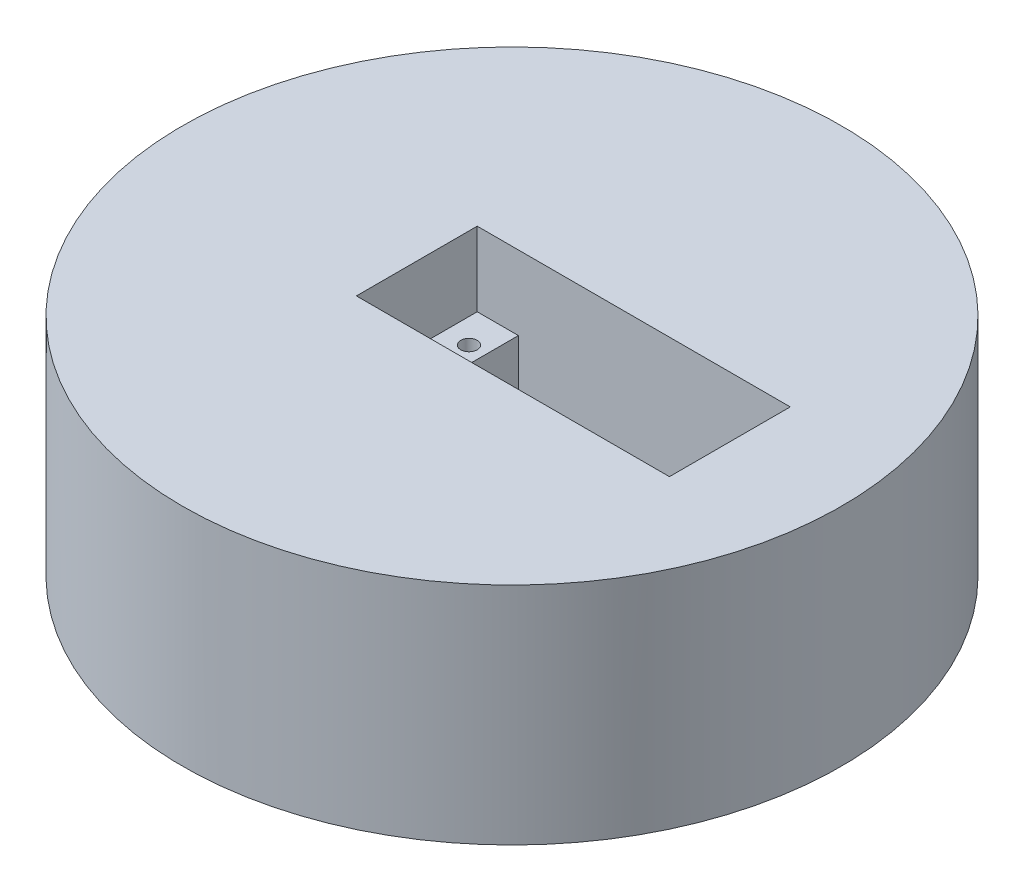
ISO-10303-21;
HEADER;
FILE_DESCRIPTION(('STEP AP214'),'2;1');
FILE_NAME('part.step','',(''),(''),'','','');
FILE_SCHEMA(('AUTOMOTIVE_DESIGN { 1 0 10303 214 1 1 1 1 }'));
ENDSEC;
DATA;
#1=APPLICATION_CONTEXT('core data for automotive mechanical design processes');
#2=APPLICATION_PROTOCOL_DEFINITION('international standard','automotive_design',2000,#1);
#3=PRODUCT_CONTEXT('',#1,'mechanical');
#4=PRODUCT('Part','Part','',(#3));
#5=PRODUCT_RELATED_PRODUCT_CATEGORY('part','',(#4));
#6=PRODUCT_DEFINITION_FORMATION('','',#4);
#7=PRODUCT_DEFINITION_CONTEXT('part definition',#1,'design');
#8=PRODUCT_DEFINITION('design','',#6,#7);
#9=PRODUCT_DEFINITION_SHAPE('','',#8);
#10=(LENGTH_UNIT() NAMED_UNIT(*) SI_UNIT(.MILLI.,.METRE.));
#11=(NAMED_UNIT(*) PLANE_ANGLE_UNIT() SI_UNIT($,.RADIAN.));
#12=(NAMED_UNIT(*) SI_UNIT($,.STERADIAN.) SOLID_ANGLE_UNIT());
#13=UNCERTAINTY_MEASURE_WITH_UNIT(LENGTH_MEASURE(1.E-05),#10,'distance_accuracy_value','');
#14=(GEOMETRIC_REPRESENTATION_CONTEXT(3) GLOBAL_UNCERTAINTY_ASSIGNED_CONTEXT((#13)) GLOBAL_UNIT_ASSIGNED_CONTEXT((#10,
#11,#12)) REPRESENTATION_CONTEXT('',''));
#15=CARTESIAN_POINT('',(0.,0.,0.));
#16=DIRECTION('',(0.,0.,1.));
#17=DIRECTION('',(1.,0.,0.));
#18=AXIS2_PLACEMENT_3D('',#15,#16,#17);
#19=CARTESIAN_POINT('',(0.,0.,0.));
#20=DIRECTION('',(0.,1.,0.));
#21=DIRECTION('',(0.,0.,1.));
#22=AXIS2_PLACEMENT_3D('',#19,#20,#21);
#23=PLANE('',#22);
#24=DIRECTION('',(-1.,0.,0.));
#25=VECTOR('',#24,1.);
#26=CARTESIAN_POINT('',(0.,0.,-11.));
#27=LINE('',#26,#25);
#28=CARTESIAN_POINT('',(28.5,0.,-11.));
#29=VERTEX_POINT('',#28);
#30=CARTESIAN_POINT('',(-70.1530484122345,0.,-11.));
#31=VERTEX_POINT('',#30);
#32=EDGE_CURVE('E153',#29,#31,#27,.T.);
#33=ORIENTED_EDGE('',*,*,#32,.T.);
#34=CARTESIAN_POINT('',(-11.17,0.,0.));
#35=DIRECTION('',(0.,1.,0.));
#36=DIRECTION('',(0.,0.,1.));
#37=AXIS2_PLACEMENT_3D('',#34,#35,#36);
#38=CIRCLE('',#37,60.);
#39=CARTESIAN_POINT('',(-70.1530484122345,0.,11.));
#40=VERTEX_POINT('',#39);
#41=EDGE_CURVE('E161',#40,#31,#38,.T.);
#42=ORIENTED_EDGE('',*,*,#41,.F.);
#43=DIRECTION('',(-1.,0.,0.));
#44=VECTOR('',#43,1.);
#45=CARTESIAN_POINT('',(0.,0.,11.));
#46=LINE('',#45,#44);
#47=CARTESIAN_POINT('',(28.5,0.,11.));
#48=VERTEX_POINT('',#47);
#49=EDGE_CURVE('E140',#48,#40,#46,.T.);
#50=ORIENTED_EDGE('',*,*,#49,.F.);
#51=DIRECTION('',(0.,0.,-1.));
#52=VECTOR('',#51,1.);
#53=CARTESIAN_POINT('',(28.5,0.,0.));
#54=LINE('',#53,#52);
#55=EDGE_CURVE('E233',#48,#29,#54,.T.);
#56=ORIENTED_EDGE('',*,*,#55,.T.);
#57=EDGE_LOOP('',(#33,#42,#50,#56));
#58=FACE_BOUND('',#57,.T.);
#59=ADVANCED_FACE('F48',(#58),#23,.F.);
#60=CARTESIAN_POINT('',(-21.,27.5,0.));
#61=DIRECTION('',(-1.,0.,0.));
#62=DIRECTION('',(0.,0.,1.));
#63=AXIS2_PLACEMENT_3D('',#60,#61,#62);
#64=PLANE('',#63);
#65=DIRECTION('',(0.,-1.,0.));
#66=VECTOR('',#65,1.);
#67=CARTESIAN_POINT('',(-21.,27.5,11.));
#68=LINE('',#67,#66);
#69=CARTESIAN_POINT('',(-21.,27.5,11.));
#70=VERTEX_POINT('',#69);
#71=CARTESIAN_POINT('',(-21.,15.,11.));
#72=VERTEX_POINT('',#71);
#73=EDGE_CURVE('E11',#70,#72,#68,.T.);
#74=ORIENTED_EDGE('',*,*,#73,.T.);
#75=DIRECTION('',(0.,0.,-1.));
#76=VECTOR('',#75,1.);
#77=CARTESIAN_POINT('',(-21.,15.,0.));
#78=LINE('',#77,#76);
#79=CARTESIAN_POINT('',(-21.,15.,-11.));
#80=VERTEX_POINT('',#79);
#81=EDGE_CURVE('E225',#72,#80,#78,.T.);
#82=ORIENTED_EDGE('',*,*,#81,.T.);
#83=DIRECTION('',(0.,-1.,0.));
#84=VECTOR('',#83,1.);
#85=CARTESIAN_POINT('',(-21.,27.5,-11.));
#86=LINE('',#85,#84);
#87=CARTESIAN_POINT('',(-21.,27.5,-11.));
#88=VERTEX_POINT('',#87);
#89=EDGE_CURVE('E57',#88,#80,#86,.T.);
#90=ORIENTED_EDGE('',*,*,#89,.F.);
#91=DIRECTION('',(0.,0.,-1.));
#92=VECTOR('',#91,1.);
#93=CARTESIAN_POINT('',(-21.,27.5,0.));
#94=LINE('',#93,#92);
#95=EDGE_CURVE('E210',#70,#88,#94,.T.);
#96=ORIENTED_EDGE('',*,*,#95,.F.);
#97=EDGE_LOOP('',(#74,#82,#90,#96));
#98=FACE_BOUND('',#97,.T.);
#99=ADVANCED_FACE('F223',(#98),#64,.F.);
#100=CARTESIAN_POINT('',(-24.,27.5,-5.));
#101=DIRECTION('',(0.,-1.,0.));
#102=DIRECTION('',(0.,0.,-1.));
#103=AXIS2_PLACEMENT_3D('',#100,#101,#102);
#104=CYLINDRICAL_SURFACE('',#103,1.5);
#105=CARTESIAN_POINT('',(-24.,15.,-5.));
#106=DIRECTION('',(0.,1.,0.));
#107=DIRECTION('',(0.,0.,1.));
#108=AXIS2_PLACEMENT_3D('',#105,#106,#107);
#109=CIRCLE('',#108,1.5);
#110=CARTESIAN_POINT('',(-24.,15.,-3.5));
#111=VERTEX_POINT('',#110);
#112=EDGE_CURVE('E235',#111,#111,#109,.T.);
#113=ORIENTED_EDGE('',*,*,#112,.F.);
#114=EDGE_LOOP('',(#113));
#115=FACE_BOUND('',#114,.T.);
#116=CARTESIAN_POINT('',(-24.,27.5,-5.));
#117=DIRECTION('',(0.,1.,0.));
#118=DIRECTION('',(0.,0.,1.));
#119=AXIS2_PLACEMENT_3D('',#116,#117,#118);
#120=CIRCLE('',#119,1.5);
#121=CARTESIAN_POINT('',(-24.,27.5,-3.5));
#122=VERTEX_POINT('',#121);
#123=EDGE_CURVE('E199',#122,#122,#120,.T.);
#124=ORIENTED_EDGE('',*,*,#123,.T.);
#125=EDGE_LOOP('',(#124));
#126=FACE_BOUND('',#125,.T.);
#127=ADVANCED_FACE('F305',(#115,#126),#104,.F.);
#128=CARTESIAN_POINT('',(-24.,27.5,5.));
#129=DIRECTION('',(0.,-1.,0.));
#130=DIRECTION('',(0.,0.,-1.));
#131=AXIS2_PLACEMENT_3D('',#128,#129,#130);
#132=CYLINDRICAL_SURFACE('',#131,1.5);
#133=CARTESIAN_POINT('',(-24.,15.,5.));
#134=DIRECTION('',(0.,1.,0.));
#135=DIRECTION('',(0.,0.,1.));
#136=AXIS2_PLACEMENT_3D('',#133,#134,#135);
#137=CIRCLE('',#136,1.5);
#138=CARTESIAN_POINT('',(-24.,15.,6.5));
#139=VERTEX_POINT('',#138);
#140=EDGE_CURVE('E357',#139,#139,#137,.T.);
#141=ORIENTED_EDGE('',*,*,#140,.F.);
#142=EDGE_LOOP('',(#141));
#143=FACE_BOUND('',#142,.T.);
#144=CARTESIAN_POINT('',(-24.,27.5,5.));
#145=DIRECTION('',(0.,1.,0.));
#146=DIRECTION('',(0.,0.,1.));
#147=AXIS2_PLACEMENT_3D('',#144,#145,#146);
#148=CIRCLE('',#147,1.5);
#149=CARTESIAN_POINT('',(-24.,27.5,6.5));
#150=VERTEX_POINT('',#149);
#151=EDGE_CURVE('E195',#150,#150,#148,.T.);
#152=ORIENTED_EDGE('',*,*,#151,.T.);
#153=EDGE_LOOP('',(#152));
#154=FACE_BOUND('',#153,.T.);
#155=ADVANCED_FACE('F50',(#143,#154),#132,.F.);
#156=CARTESIAN_POINT('',(0.,27.5,0.));
#157=DIRECTION('',(0.,1.,0.));
#158=DIRECTION('',(0.,0.,1.));
#159=AXIS2_PLACEMENT_3D('',#156,#157,#158);
#160=PLANE('',#159);
#161=ORIENTED_EDGE('',*,*,#151,.F.);
#162=EDGE_LOOP('',(#161));
#163=FACE_BOUND('',#162,.T.);
#164=ORIENTED_EDGE('',*,*,#123,.F.);
#165=EDGE_LOOP('',(#164));
#166=FACE_BOUND('',#165,.T.);
#167=DIRECTION('',(0.,0.,-1.));
#168=VECTOR('',#167,1.);
#169=CARTESIAN_POINT('',(-28.5,27.5,0.));
#170=LINE('',#169,#168);
#171=CARTESIAN_POINT('',(-28.5,27.5,11.));
#172=VERTEX_POINT('',#171);
#173=CARTESIAN_POINT('',(-28.5,27.5,-11.));
#174=VERTEX_POINT('',#173);
#175=EDGE_CURVE('E203',#172,#174,#170,.T.);
#176=ORIENTED_EDGE('',*,*,#175,.F.);
#177=DIRECTION('',(-1.,0.,0.));
#178=VECTOR('',#177,1.);
#179=CARTESIAN_POINT('',(0.,27.5,11.));
#180=LINE('',#179,#178);
#181=EDGE_CURVE('E206',#70,#172,#180,.T.);
#182=ORIENTED_EDGE('',*,*,#181,.F.);
#183=ORIENTED_EDGE('',*,*,#95,.T.);
#184=DIRECTION('',(-1.,0.,0.));
#185=VECTOR('',#184,1.);
#186=CARTESIAN_POINT('',(0.,27.5,-11.));
#187=LINE('',#186,#185);
#188=EDGE_CURVE('E72',#88,#174,#187,.T.);
#189=ORIENTED_EDGE('',*,*,#188,.T.);
#190=EDGE_LOOP('',(#176,#182,#183,#189));
#191=FACE_BOUND('',#190,.T.);
#192=ADVANCED_FACE('F308',(#163,#166,#191),#160,.T.);
#193=CARTESIAN_POINT('',(0.,41.,11.));
#194=DIRECTION('',(0.,0.,1.));
#195=DIRECTION('',(1.,0.,0.));
#196=AXIS2_PLACEMENT_3D('',#193,#194,#195);
#197=PLANE('',#196);
#198=DIRECTION('',(-1.,0.,0.));
#199=VECTOR('',#198,1.);
#200=CARTESIAN_POINT('',(0.,27.5,11.));
#201=LINE('',#200,#199);
#202=CARTESIAN_POINT('',(28.5,27.5,11.));
#203=VERTEX_POINT('',#202);
#204=CARTESIAN_POINT('',(21.,27.5,11.));
#205=VERTEX_POINT('',#204);
#206=EDGE_CURVE('E254',#203,#205,#201,.T.);
#207=ORIENTED_EDGE('',*,*,#206,.T.);
#208=DIRECTION('',(0.,-1.,0.));
#209=VECTOR('',#208,1.);
#210=CARTESIAN_POINT('',(21.,27.5,11.));
#211=LINE('',#210,#209);
#212=CARTESIAN_POINT('',(21.,15.,11.));
#213=VERTEX_POINT('',#212);
#214=EDGE_CURVE('E261',#205,#213,#211,.T.);
#215=ORIENTED_EDGE('',*,*,#214,.T.);
#216=DIRECTION('',(-1.,0.,0.));
#217=VECTOR('',#216,1.);
#218=CARTESIAN_POINT('',(0.,15.,11.));
#219=LINE('',#218,#217);
#220=CARTESIAN_POINT('',(28.5,15.,11.));
#221=VERTEX_POINT('',#220);
#222=EDGE_CURVE('E64',#221,#213,#219,.T.);
#223=ORIENTED_EDGE('',*,*,#222,.F.);
#224=DIRECTION('',(0.,-1.,0.));
#225=VECTOR('',#224,1.);
#226=CARTESIAN_POINT('',(28.5,15.,11.));
#227=LINE('',#226,#225);
#228=EDGE_CURVE('E147',#221,#48,#227,.T.);
#229=ORIENTED_EDGE('',*,*,#228,.T.);
#230=ORIENTED_EDGE('',*,*,#49,.T.);
#231=DIRECTION('',(0.,-1.,0.));
#232=VECTOR('',#231,1.);
#233=CARTESIAN_POINT('',(-70.1530484122345,41.,11.));
#234=LINE('',#233,#232);
#235=CARTESIAN_POINT('',(-70.1530484122345,15.,11.));
#236=VERTEX_POINT('',#235);
#237=EDGE_CURVE('E145',#236,#40,#234,.T.);
#238=ORIENTED_EDGE('',*,*,#237,.F.);
#239=DIRECTION('',(-1.,0.,0.));
#240=VECTOR('',#239,1.);
#241=CARTESIAN_POINT('',(0.,15.,11.));
#242=LINE('',#241,#240);
#243=EDGE_CURVE('E229',#72,#236,#242,.T.);
#244=ORIENTED_EDGE('',*,*,#243,.F.);
#245=ORIENTED_EDGE('',*,*,#73,.F.);
#246=ORIENTED_EDGE('',*,*,#181,.T.);
#247=DIRECTION('',(0.,-1.,0.));
#248=VECTOR('',#247,1.);
#249=CARTESIAN_POINT('',(-28.5,41.,11.));
#250=LINE('',#249,#248);
#251=CARTESIAN_POINT('',(-28.5,41.,11.));
#252=VERTEX_POINT('',#251);
#253=EDGE_CURVE('E191',#252,#172,#250,.T.);
#254=ORIENTED_EDGE('',*,*,#253,.F.);
#255=DIRECTION('',(-1.,0.,0.));
#256=VECTOR('',#255,1.);
#257=CARTESIAN_POINT('',(0.,41.,11.));
#258=LINE('',#257,#256);
#259=CARTESIAN_POINT('',(28.5,41.,11.));
#260=VERTEX_POINT('',#259);
#261=EDGE_CURVE('E169',#260,#252,#258,.T.);
#262=ORIENTED_EDGE('',*,*,#261,.F.);
#263=DIRECTION('',(0.,-1.,0.));
#264=VECTOR('',#263,1.);
#265=CARTESIAN_POINT('',(28.5,41.,11.));
#266=LINE('',#265,#264);
#267=EDGE_CURVE('E178',#260,#203,#266,.T.);
#268=ORIENTED_EDGE('',*,*,#267,.T.);
#269=EDGE_LOOP('',(#207,#215,#223,#229,#230,#238,#244,#245,#246,#254,#262,#268));
#270=FACE_BOUND('',#269,.T.);
#271=ADVANCED_FACE('F143',(#270),#197,.F.);
#272=CARTESIAN_POINT('',(0.,41.,-11.));
#273=DIRECTION('',(0.,0.,1.));
#274=DIRECTION('',(1.,0.,0.));
#275=AXIS2_PLACEMENT_3D('',#272,#273,#274);
#276=PLANE('',#275);
#277=DIRECTION('',(0.,-1.,0.));
#278=VECTOR('',#277,1.);
#279=CARTESIAN_POINT('',(21.,27.5,-11.));
#280=LINE('',#279,#278);
#281=CARTESIAN_POINT('',(21.,27.5,-11.));
#282=VERTEX_POINT('',#281);
#283=CARTESIAN_POINT('',(21.,15.,-11.));
#284=VERTEX_POINT('',#283);
#285=EDGE_CURVE('E154',#282,#284,#280,.T.);
#286=ORIENTED_EDGE('',*,*,#285,.F.);
#287=DIRECTION('',(-1.,0.,0.));
#288=VECTOR('',#287,1.);
#289=CARTESIAN_POINT('',(0.,27.5,-11.));
#290=LINE('',#289,#288);
#291=CARTESIAN_POINT('',(28.5,27.5,-11.));
#292=VERTEX_POINT('',#291);
#293=EDGE_CURVE('E247',#292,#282,#290,.T.);
#294=ORIENTED_EDGE('',*,*,#293,.F.);
#295=DIRECTION('',(0.,-1.,0.));
#296=VECTOR('',#295,1.);
#297=CARTESIAN_POINT('',(28.5,41.,-11.));
#298=LINE('',#297,#296);
#299=CARTESIAN_POINT('',(28.5,41.,-11.));
#300=VERTEX_POINT('',#299);
#301=EDGE_CURVE('E182',#300,#292,#298,.T.);
#302=ORIENTED_EDGE('',*,*,#301,.F.);
#303=DIRECTION('',(-1.,0.,0.));
#304=VECTOR('',#303,1.);
#305=CARTESIAN_POINT('',(0.,41.,-11.));
#306=LINE('',#305,#304);
#307=CARTESIAN_POINT('',(-28.5,41.,-11.));
#308=VERTEX_POINT('',#307);
#309=EDGE_CURVE('E270',#300,#308,#306,.T.);
#310=ORIENTED_EDGE('',*,*,#309,.T.);
#311=DIRECTION('',(0.,-1.,0.));
#312=VECTOR('',#311,1.);
#313=CARTESIAN_POINT('',(-28.5,41.,-11.));
#314=LINE('',#313,#312);
#315=EDGE_CURVE('E187',#308,#174,#314,.T.);
#316=ORIENTED_EDGE('',*,*,#315,.T.);
#317=ORIENTED_EDGE('',*,*,#188,.F.);
#318=ORIENTED_EDGE('',*,*,#89,.T.);
#319=DIRECTION('',(-1.,0.,0.));
#320=VECTOR('',#319,1.);
#321=CARTESIAN_POINT('',(0.,15.,-11.));
#322=LINE('',#321,#320);
#323=CARTESIAN_POINT('',(-70.1530484122345,15.,-11.));
#324=VERTEX_POINT('',#323);
#325=EDGE_CURVE('E220',#80,#324,#322,.T.);
#326=ORIENTED_EDGE('',*,*,#325,.T.);
#327=DIRECTION('',(0.,-1.,0.));
#328=VECTOR('',#327,1.);
#329=CARTESIAN_POINT('',(-70.1530484122345,41.,-11.));
#330=LINE('',#329,#328);
#331=EDGE_CURVE('E165',#31,#324,#330,.F.);
#332=ORIENTED_EDGE('',*,*,#331,.F.);
#333=ORIENTED_EDGE('',*,*,#32,.F.);
#334=DIRECTION('',(0.,-1.,0.));
#335=VECTOR('',#334,1.);
#336=CARTESIAN_POINT('',(28.5,15.,-11.));
#337=LINE('',#336,#335);
#338=CARTESIAN_POINT('',(28.5,15.,-11.));
#339=VERTEX_POINT('',#338);
#340=EDGE_CURVE('E244',#339,#29,#337,.T.);
#341=ORIENTED_EDGE('',*,*,#340,.F.);
#342=DIRECTION('',(-1.,0.,0.));
#343=VECTOR('',#342,1.);
#344=CARTESIAN_POINT('',(0.,15.,-11.));
#345=LINE('',#344,#343);
#346=EDGE_CURVE('E336',#339,#284,#345,.T.);
#347=ORIENTED_EDGE('',*,*,#346,.T.);
#348=EDGE_LOOP('',(#286,#294,#302,#310,#316,#317,#318,#326,#332,#333,#341,#347));
#349=FACE_BOUND('',#348,.T.);
#350=ADVANCED_FACE('F219',(#349),#276,.T.);
#351=CARTESIAN_POINT('',(-28.5,41.,0.));
#352=DIRECTION('',(-1.,0.,0.));
#353=DIRECTION('',(0.,0.,1.));
#354=AXIS2_PLACEMENT_3D('',#351,#352,#353);
#355=PLANE('',#354);
#356=ORIENTED_EDGE('',*,*,#175,.T.);
#357=ORIENTED_EDGE('',*,*,#315,.F.);
#358=DIRECTION('',(0.,0.,-1.));
#359=VECTOR('',#358,1.);
#360=CARTESIAN_POINT('',(-28.5,41.,0.));
#361=LINE('',#360,#359);
#362=EDGE_CURVE('E174',#252,#308,#361,.T.);
#363=ORIENTED_EDGE('',*,*,#362,.F.);
#364=ORIENTED_EDGE('',*,*,#253,.T.);
#365=EDGE_LOOP('',(#356,#357,#363,#364));
#366=FACE_BOUND('',#365,.T.);
#367=ADVANCED_FACE('F295',(#366),#355,.F.);
#368=CARTESIAN_POINT('',(28.5,41.,0.));
#369=DIRECTION('',(-1.,0.,0.));
#370=DIRECTION('',(0.,0.,1.));
#371=AXIS2_PLACEMENT_3D('',#368,#369,#370);
#372=PLANE('',#371);
#373=DIRECTION('',(0.,0.,-1.));
#374=VECTOR('',#373,1.);
#375=CARTESIAN_POINT('',(28.5,27.5,0.));
#376=LINE('',#375,#374);
#377=EDGE_CURVE('E243',#203,#292,#376,.T.);
#378=ORIENTED_EDGE('',*,*,#377,.F.);
#379=ORIENTED_EDGE('',*,*,#267,.F.);
#380=DIRECTION('',(0.,0.,-1.));
#381=VECTOR('',#380,1.);
#382=CARTESIAN_POINT('',(28.5,41.,0.));
#383=LINE('',#382,#381);
#384=EDGE_CURVE('E274',#260,#300,#383,.T.);
#385=ORIENTED_EDGE('',*,*,#384,.T.);
#386=ORIENTED_EDGE('',*,*,#301,.T.);
#387=EDGE_LOOP('',(#378,#379,#385,#386));
#388=FACE_BOUND('',#387,.T.);
#389=ADVANCED_FACE('F284',(#388),#372,.T.);
#390=CARTESIAN_POINT('',(-11.17,41.,0.));
#391=DIRECTION('',(0.,-1.,0.));
#392=DIRECTION('',(0.,0.,-1.));
#393=AXIS2_PLACEMENT_3D('',#390,#391,#392);
#394=CYLINDRICAL_SURFACE('',#393,60.);
#395=ORIENTED_EDGE('',*,*,#41,.T.);
#396=ORIENTED_EDGE('',*,*,#331,.T.);
#397=CARTESIAN_POINT('',(-11.17,15.,0.));
#398=DIRECTION('',(0.,1.,0.));
#399=DIRECTION('',(0.,0.,1.));
#400=AXIS2_PLACEMENT_3D('',#397,#398,#399);
#401=CIRCLE('',#400,60.);
#402=EDGE_CURVE('E163',#324,#236,#401,.T.);
#403=ORIENTED_EDGE('',*,*,#402,.T.);
#404=ORIENTED_EDGE('',*,*,#237,.T.);
#405=EDGE_LOOP('',(#395,#396,#403,#404));
#406=FACE_BOUND('',#405,.T.);
#407=CARTESIAN_POINT('',(-11.17,41.,0.));
#408=DIRECTION('',(0.,1.,0.));
#409=DIRECTION('',(0.,0.,1.));
#410=AXIS2_PLACEMENT_3D('',#407,#408,#409);
#411=CIRCLE('',#410,60.);
#412=CARTESIAN_POINT('',(-11.17,41.,60.));
#413=VERTEX_POINT('',#412);
#414=EDGE_CURVE('E183',#413,#413,#411,.T.);
#415=ORIENTED_EDGE('',*,*,#414,.F.);
#416=EDGE_LOOP('',(#415));
#417=FACE_BOUND('',#416,.T.);
#418=ADVANCED_FACE('F158',(#406,#417),#394,.T.);
#419=CARTESIAN_POINT('',(0.,41.,0.));
#420=DIRECTION('',(0.,1.,0.));
#421=DIRECTION('',(0.,0.,1.));
#422=AXIS2_PLACEMENT_3D('',#419,#420,#421);
#423=PLANE('',#422);
#424=ORIENTED_EDGE('',*,*,#261,.T.);
#425=ORIENTED_EDGE('',*,*,#362,.T.);
#426=ORIENTED_EDGE('',*,*,#309,.F.);
#427=ORIENTED_EDGE('',*,*,#384,.F.);
#428=EDGE_LOOP('',(#424,#425,#426,#427));
#429=FACE_BOUND('',#428,.T.);
#430=ORIENTED_EDGE('',*,*,#414,.T.);
#431=EDGE_LOOP('',(#430));
#432=FACE_BOUND('',#431,.T.);
#433=ADVANCED_FACE('F282',(#429,#432),#423,.T.);
#434=CARTESIAN_POINT('',(21.,27.5,0.));
#435=DIRECTION('',(-1.,0.,0.));
#436=DIRECTION('',(0.,0.,1.));
#437=AXIS2_PLACEMENT_3D('',#434,#435,#436);
#438=PLANE('',#437);
#439=DIRECTION('',(0.,0.,-1.));
#440=VECTOR('',#439,1.);
#441=CARTESIAN_POINT('',(21.,15.,0.));
#442=LINE('',#441,#440);
#443=EDGE_CURVE('E338',#213,#284,#442,.T.);
#444=ORIENTED_EDGE('',*,*,#443,.F.);
#445=ORIENTED_EDGE('',*,*,#214,.F.);
#446=DIRECTION('',(0.,0.,-1.));
#447=VECTOR('',#446,1.);
#448=CARTESIAN_POINT('',(21.,27.5,0.));
#449=LINE('',#448,#447);
#450=EDGE_CURVE('E250',#205,#282,#449,.T.);
#451=ORIENTED_EDGE('',*,*,#450,.T.);
#452=ORIENTED_EDGE('',*,*,#285,.T.);
#453=EDGE_LOOP('',(#444,#445,#451,#452));
#454=FACE_BOUND('',#453,.T.);
#455=ADVANCED_FACE('F291',(#454),#438,.T.);
#456=CARTESIAN_POINT('',(24.,27.5,5.));
#457=DIRECTION('',(0.,-1.,0.));
#458=DIRECTION('',(0.,0.,-1.));
#459=AXIS2_PLACEMENT_3D('',#456,#457,#458);
#460=CYLINDRICAL_SURFACE('',#459,1.5);
#461=CARTESIAN_POINT('',(24.,15.,5.));
#462=DIRECTION('',(0.,1.,0.));
#463=DIRECTION('',(0.,0.,1.));
#464=AXIS2_PLACEMENT_3D('',#461,#462,#463);
#465=CIRCLE('',#464,1.5);
#466=CARTESIAN_POINT('',(24.,15.,6.5));
#467=VERTEX_POINT('',#466);
#468=EDGE_CURVE('E351',#467,#467,#465,.F.);
#469=ORIENTED_EDGE('',*,*,#468,.T.);
#470=EDGE_LOOP('',(#469));
#471=FACE_BOUND('',#470,.T.);
#472=CARTESIAN_POINT('',(24.,27.5,5.));
#473=DIRECTION('',(0.,1.,0.));
#474=DIRECTION('',(0.,0.,1.));
#475=AXIS2_PLACEMENT_3D('',#472,#473,#474);
#476=CIRCLE('',#475,1.5);
#477=CARTESIAN_POINT('',(24.,27.5,6.5));
#478=VERTEX_POINT('',#477);
#479=EDGE_CURVE('E239',#478,#478,#476,.F.);
#480=ORIENTED_EDGE('',*,*,#479,.F.);
#481=EDGE_LOOP('',(#480));
#482=FACE_BOUND('',#481,.T.);
#483=ADVANCED_FACE('F388',(#471,#482),#460,.F.);
#484=CARTESIAN_POINT('',(24.,27.5,-5.));
#485=DIRECTION('',(0.,-1.,0.));
#486=DIRECTION('',(0.,0.,-1.));
#487=AXIS2_PLACEMENT_3D('',#484,#485,#486);
#488=CYLINDRICAL_SURFACE('',#487,1.5);
#489=CARTESIAN_POINT('',(24.,15.,-5.));
#490=DIRECTION('',(0.,1.,0.));
#491=DIRECTION('',(0.,0.,1.));
#492=AXIS2_PLACEMENT_3D('',#489,#490,#491);
#493=CIRCLE('',#492,1.5);
#494=CARTESIAN_POINT('',(24.,15.,-3.5));
#495=VERTEX_POINT('',#494);
#496=EDGE_CURVE('E340',#495,#495,#493,.F.);
#497=ORIENTED_EDGE('',*,*,#496,.T.);
#498=EDGE_LOOP('',(#497));
#499=FACE_BOUND('',#498,.T.);
#500=CARTESIAN_POINT('',(24.,27.5,-5.));
#501=DIRECTION('',(0.,1.,0.));
#502=DIRECTION('',(0.,0.,1.));
#503=AXIS2_PLACEMENT_3D('',#500,#501,#502);
#504=CIRCLE('',#503,1.5);
#505=CARTESIAN_POINT('',(24.,27.5,-3.5));
#506=VERTEX_POINT('',#505);
#507=EDGE_CURVE('E257',#506,#506,#504,.F.);
#508=ORIENTED_EDGE('',*,*,#507,.F.);
#509=EDGE_LOOP('',(#508));
#510=FACE_BOUND('',#509,.T.);
#511=ADVANCED_FACE('F385',(#499,#510),#488,.F.);
#512=CARTESIAN_POINT('',(0.,27.5,0.));
#513=DIRECTION('',(0.,1.,0.));
#514=DIRECTION('',(0.,0.,1.));
#515=AXIS2_PLACEMENT_3D('',#512,#513,#514);
#516=PLANE('',#515);
#517=ORIENTED_EDGE('',*,*,#479,.T.);
#518=EDGE_LOOP('',(#517));
#519=FACE_BOUND('',#518,.T.);
#520=ORIENTED_EDGE('',*,*,#377,.T.);
#521=ORIENTED_EDGE('',*,*,#293,.T.);
#522=ORIENTED_EDGE('',*,*,#450,.F.);
#523=ORIENTED_EDGE('',*,*,#206,.F.);
#524=EDGE_LOOP('',(#520,#521,#522,#523));
#525=FACE_BOUND('',#524,.T.);
#526=ORIENTED_EDGE('',*,*,#507,.T.);
#527=EDGE_LOOP('',(#526));
#528=FACE_BOUND('',#527,.T.);
#529=ADVANCED_FACE('F332',(#519,#525,#528),#516,.T.);
#530=CARTESIAN_POINT('',(28.5,15.,0.));
#531=DIRECTION('',(-1.,0.,0.));
#532=DIRECTION('',(0.,0.,1.));
#533=AXIS2_PLACEMENT_3D('',#530,#531,#532);
#534=PLANE('',#533);
#535=ORIENTED_EDGE('',*,*,#55,.F.);
#536=ORIENTED_EDGE('',*,*,#228,.F.);
#537=DIRECTION('',(0.,0.,-1.));
#538=VECTOR('',#537,1.);
#539=CARTESIAN_POINT('',(28.5,15.,0.));
#540=LINE('',#539,#538);
#541=EDGE_CURVE('E374',#221,#339,#540,.T.);
#542=ORIENTED_EDGE('',*,*,#541,.T.);
#543=ORIENTED_EDGE('',*,*,#340,.T.);
#544=EDGE_LOOP('',(#535,#536,#542,#543));
#545=FACE_BOUND('',#544,.T.);
#546=ADVANCED_FACE('F379',(#545),#534,.T.);
#547=CARTESIAN_POINT('',(0.,15.,0.));
#548=DIRECTION('',(0.,1.,0.));
#549=DIRECTION('',(0.,0.,1.));
#550=AXIS2_PLACEMENT_3D('',#547,#548,#549);
#551=PLANE('',#550);
#552=ORIENTED_EDGE('',*,*,#468,.F.);
#553=EDGE_LOOP('',(#552));
#554=FACE_BOUND('',#553,.T.);
#555=ORIENTED_EDGE('',*,*,#541,.F.);
#556=ORIENTED_EDGE('',*,*,#222,.T.);
#557=ORIENTED_EDGE('',*,*,#443,.T.);
#558=ORIENTED_EDGE('',*,*,#346,.F.);
#559=EDGE_LOOP('',(#555,#556,#557,#558));
#560=FACE_BOUND('',#559,.T.);
#561=ORIENTED_EDGE('',*,*,#496,.F.);
#562=EDGE_LOOP('',(#561));
#563=FACE_BOUND('',#562,.T.);
#564=ADVANCED_FACE('F363',(#554,#560,#563),#551,.F.);
#565=CARTESIAN_POINT('',(0.,15.,0.));
#566=DIRECTION('',(0.,1.,0.));
#567=DIRECTION('',(0.,0.,1.));
#568=AXIS2_PLACEMENT_3D('',#565,#566,#567);
#569=PLANE('',#568);
#570=ORIENTED_EDGE('',*,*,#140,.T.);
#571=EDGE_LOOP('',(#570));
#572=FACE_BOUND('',#571,.T.);
#573=ORIENTED_EDGE('',*,*,#112,.T.);
#574=EDGE_LOOP('',(#573));
#575=FACE_BOUND('',#574,.T.);
#576=ORIENTED_EDGE('',*,*,#243,.T.);
#577=ORIENTED_EDGE('',*,*,#402,.F.);
#578=ORIENTED_EDGE('',*,*,#325,.F.);
#579=ORIENTED_EDGE('',*,*,#81,.F.);
#580=EDGE_LOOP('',(#576,#577,#578,#579));
#581=FACE_BOUND('',#580,.T.);
#582=ADVANCED_FACE('F362',(#572,#575,#581),#569,.F.);
#583=CLOSED_SHELL('',(#59,#99,#127,#155,#192,#271,#350,#367,#389,#418,#433,#455,#483,#511,#529,
#546,#564,#582));
#584=MANIFOLD_SOLID_BREP('B2',#583);
#585=ADVANCED_BREP_SHAPE_REPRESENTATION('',(#18,#584),#14);
#586=SHAPE_DEFINITION_REPRESENTATION(#9,#585);
ENDSEC;
END-ISO-10303-21;
